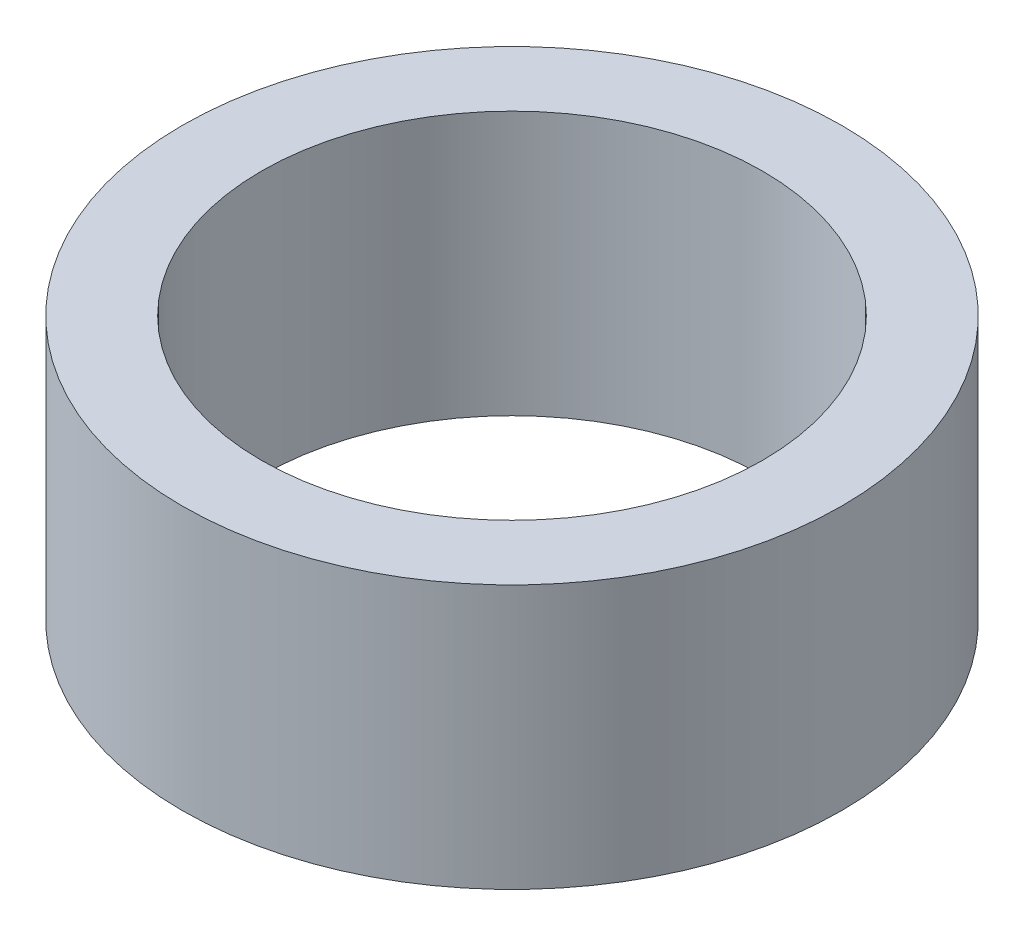
ISO-10303-21;
HEADER;
FILE_DESCRIPTION(('STEP AP214'),'2;1');
FILE_NAME('part.step','',(''),(''),'','','');
FILE_SCHEMA(('AUTOMOTIVE_DESIGN { 1 0 10303 214 1 1 1 1 }'));
ENDSEC;
DATA;
#1=APPLICATION_CONTEXT('core data for automotive mechanical design processes');
#2=APPLICATION_PROTOCOL_DEFINITION('international standard','automotive_design',2000,#1);
#3=PRODUCT_CONTEXT('',#1,'mechanical');
#4=PRODUCT('Part','Part','',(#3));
#5=PRODUCT_RELATED_PRODUCT_CATEGORY('part','',(#4));
#6=PRODUCT_DEFINITION_FORMATION('','',#4);
#7=PRODUCT_DEFINITION_CONTEXT('part definition',#1,'design');
#8=PRODUCT_DEFINITION('design','',#6,#7);
#9=PRODUCT_DEFINITION_SHAPE('','',#8);
#10=(LENGTH_UNIT() NAMED_UNIT(*) SI_UNIT(.MILLI.,.METRE.));
#11=(NAMED_UNIT(*) PLANE_ANGLE_UNIT() SI_UNIT($,.RADIAN.));
#12=(NAMED_UNIT(*) SI_UNIT($,.STERADIAN.) SOLID_ANGLE_UNIT());
#13=UNCERTAINTY_MEASURE_WITH_UNIT(LENGTH_MEASURE(1.E-05),#10,'distance_accuracy_value','');
#14=(GEOMETRIC_REPRESENTATION_CONTEXT(3) GLOBAL_UNCERTAINTY_ASSIGNED_CONTEXT((#13)) GLOBAL_UNIT_ASSIGNED_CONTEXT((#10,
#11,#12)) REPRESENTATION_CONTEXT('',''));
#15=CARTESIAN_POINT('',(0.,0.,0.));
#16=DIRECTION('',(0.,0.,1.));
#17=DIRECTION('',(1.,0.,0.));
#18=AXIS2_PLACEMENT_3D('',#15,#16,#17);
#19=CARTESIAN_POINT('',(0.,5.,0.));
#20=DIRECTION('',(0.,1.,0.));
#21=DIRECTION('',(0.,0.,1.));
#22=AXIS2_PLACEMENT_3D('',#19,#20,#21);
#23=PLANE('',#22);
#24=CARTESIAN_POINT('',(0.,5.,0.));
#25=DIRECTION('',(0.,1.,0.));
#26=DIRECTION('',(0.,0.,1.));
#27=AXIS2_PLACEMENT_3D('',#24,#25,#26);
#28=CIRCLE('',#27,6.25);
#29=CARTESIAN_POINT('',(0.,5.,6.25));
#30=VERTEX_POINT('',#29);
#31=EDGE_CURVE('E10',#30,#30,#28,.T.);
#32=ORIENTED_EDGE('',*,*,#31,.T.);
#33=EDGE_LOOP('',(#32));
#34=FACE_BOUND('',#33,.T.);
#35=CARTESIAN_POINT('',(0.,5.,0.));
#36=DIRECTION('',(0.,1.,0.));
#37=DIRECTION('',(0.,0.,1.));
#38=AXIS2_PLACEMENT_3D('',#35,#36,#37);
#39=CIRCLE('',#38,4.75);
#40=CARTESIAN_POINT('',(0.,5.,4.75));
#41=VERTEX_POINT('',#40);
#42=EDGE_CURVE('E52',#41,#41,#39,.T.);
#43=ORIENTED_EDGE('',*,*,#42,.F.);
#44=EDGE_LOOP('',(#43));
#45=FACE_BOUND('',#44,.T.);
#46=ADVANCED_FACE('F41',(#34,#45),#23,.T.);
#47=CARTESIAN_POINT('',(0.,0.,0.));
#48=DIRECTION('',(0.,1.,0.));
#49=DIRECTION('',(0.,0.,1.));
#50=AXIS2_PLACEMENT_3D('',#47,#48,#49);
#51=PLANE('',#50);
#52=CARTESIAN_POINT('',(0.,0.,0.));
#53=DIRECTION('',(0.,1.,0.));
#54=DIRECTION('',(0.,0.,1.));
#55=AXIS2_PLACEMENT_3D('',#52,#53,#54);
#56=CIRCLE('',#55,6.25);
#57=CARTESIAN_POINT('',(0.,0.,6.25));
#58=VERTEX_POINT('',#57);
#59=EDGE_CURVE('E45',#58,#58,#56,.T.);
#60=ORIENTED_EDGE('',*,*,#59,.F.);
#61=EDGE_LOOP('',(#60));
#62=FACE_BOUND('',#61,.T.);
#63=CARTESIAN_POINT('',(0.,0.,0.));
#64=DIRECTION('',(0.,1.,0.));
#65=DIRECTION('',(0.,0.,1.));
#66=AXIS2_PLACEMENT_3D('',#63,#64,#65);
#67=CIRCLE('',#66,4.75);
#68=CARTESIAN_POINT('',(0.,0.,4.75));
#69=VERTEX_POINT('',#68);
#70=EDGE_CURVE('E54',#69,#69,#67,.T.);
#71=ORIENTED_EDGE('',*,*,#70,.T.);
#72=EDGE_LOOP('',(#71));
#73=FACE_BOUND('',#72,.T.);
#74=ADVANCED_FACE('F64',(#62,#73),#51,.F.);
#75=CARTESIAN_POINT('',(0.,5.,0.));
#76=DIRECTION('',(0.,-1.,0.));
#77=DIRECTION('',(0.,0.,-1.));
#78=AXIS2_PLACEMENT_3D('',#75,#76,#77);
#79=CYLINDRICAL_SURFACE('',#78,6.25);
#80=ORIENTED_EDGE('',*,*,#31,.F.);
#81=EDGE_LOOP('',(#80));
#82=FACE_BOUND('',#81,.T.);
#83=ORIENTED_EDGE('',*,*,#59,.T.);
#84=EDGE_LOOP('',(#83));
#85=FACE_BOUND('',#84,.T.);
#86=ADVANCED_FACE('F43',(#82,#85),#79,.T.);
#87=CARTESIAN_POINT('',(0.,5.,0.));
#88=DIRECTION('',(0.,-1.,0.));
#89=DIRECTION('',(0.,0.,-1.));
#90=AXIS2_PLACEMENT_3D('',#87,#88,#89);
#91=CYLINDRICAL_SURFACE('',#90,4.75);
#92=ORIENTED_EDGE('',*,*,#42,.T.);
#93=EDGE_LOOP('',(#92));
#94=FACE_BOUND('',#93,.T.);
#95=ORIENTED_EDGE('',*,*,#70,.F.);
#96=EDGE_LOOP('',(#95));
#97=FACE_BOUND('',#96,.T.);
#98=ADVANCED_FACE('F60',(#94,#97),#91,.F.);
#99=CLOSED_SHELL('',(#46,#74,#86,#98));
#100=MANIFOLD_SOLID_BREP('B2',#99);
#101=ADVANCED_BREP_SHAPE_REPRESENTATION('',(#18,#100),#14);
#102=SHAPE_DEFINITION_REPRESENTATION(#9,#101);
ENDSEC;
END-ISO-10303-21;
